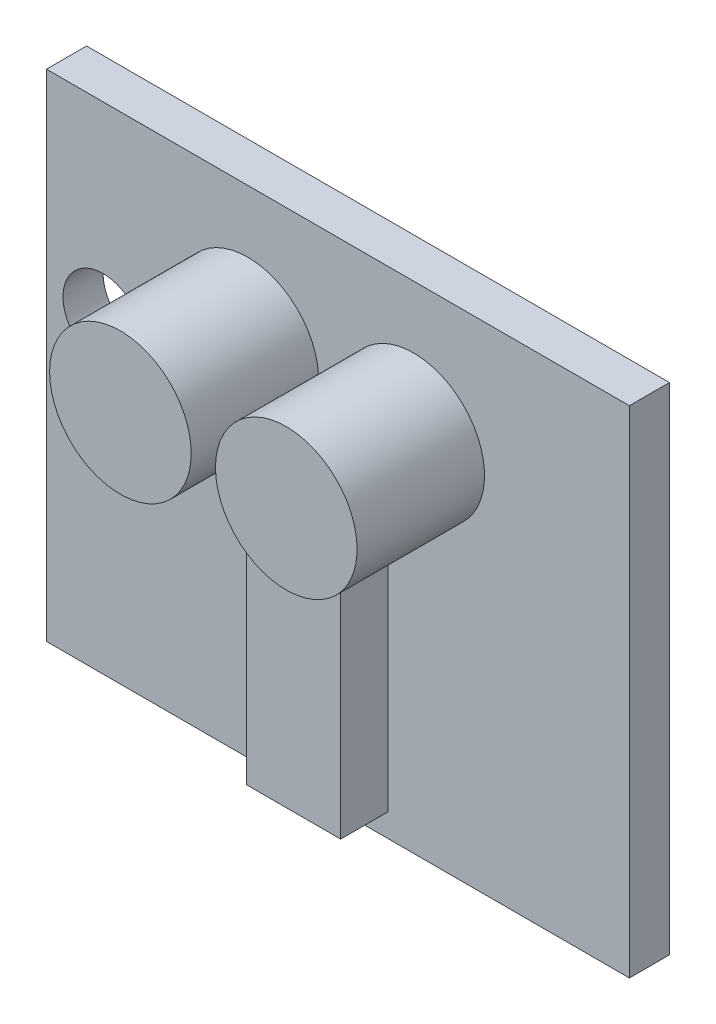
ISO-10303-21;
HEADER;
FILE_DESCRIPTION(('STEP AP214'),'2;1');
FILE_NAME('part.step','',(''),(''),'','','');
FILE_SCHEMA(('AUTOMOTIVE_DESIGN { 1 0 10303 214 1 1 1 1 }'));
ENDSEC;
DATA;
#1=APPLICATION_CONTEXT('core data for automotive mechanical design processes');
#2=APPLICATION_PROTOCOL_DEFINITION('international standard','automotive_design',2000,#1);
#3=PRODUCT_CONTEXT('',#1,'mechanical');
#4=PRODUCT('Part','Part','',(#3));
#5=PRODUCT_RELATED_PRODUCT_CATEGORY('part','',(#4));
#6=PRODUCT_DEFINITION_FORMATION('','',#4);
#7=PRODUCT_DEFINITION_CONTEXT('part definition',#1,'design');
#8=PRODUCT_DEFINITION('design','',#6,#7);
#9=PRODUCT_DEFINITION_SHAPE('','',#8);
#10=(LENGTH_UNIT() NAMED_UNIT(*) SI_UNIT(.MILLI.,.METRE.));
#11=(NAMED_UNIT(*) PLANE_ANGLE_UNIT() SI_UNIT($,.RADIAN.));
#12=(NAMED_UNIT(*) SI_UNIT($,.STERADIAN.) SOLID_ANGLE_UNIT());
#13=UNCERTAINTY_MEASURE_WITH_UNIT(LENGTH_MEASURE(1.E-05),#10,'distance_accuracy_value','');
#14=(GEOMETRIC_REPRESENTATION_CONTEXT(3) GLOBAL_UNCERTAINTY_ASSIGNED_CONTEXT((#13)) GLOBAL_UNIT_ASSIGNED_CONTEXT((#10,
#11,#12)) REPRESENTATION_CONTEXT('',''));
#15=CARTESIAN_POINT('',(0.,0.,0.));
#16=DIRECTION('',(0.,0.,1.));
#17=DIRECTION('',(1.,0.,0.));
#18=AXIS2_PLACEMENT_3D('',#15,#16,#17);
#19=CARTESIAN_POINT('',(0.,0.,1.7));
#20=DIRECTION('',(0.,0.,1.));
#21=DIRECTION('',(1.,0.,0.));
#22=AXIS2_PLACEMENT_3D('',#19,#20,#21);
#23=PLANE('',#22);
#24=CARTESIAN_POINT('',(-20.7967140729682,124.860667320047,1.7));
#25=DIRECTION('',(0.,0.,1.));
#26=DIRECTION('',(1.,0.,0.));
#27=AXIS2_PLACEMENT_3D('',#24,#25,#26);
#28=CIRCLE('',#27,3.);
#29=CARTESIAN_POINT('',(-23.7967140729682,124.860667320047,1.7));
#30=VERTEX_POINT('',#29);
#31=EDGE_CURVE('E133',#30,#30,#28,.T.);
#32=ORIENTED_EDGE('',*,*,#31,.F.);
#33=EDGE_LOOP('',(#32));
#34=FACE_BOUND('',#33,.T.);
#35=CARTESIAN_POINT('',(-27.8250173424759,124.860667320047,1.7));
#36=DIRECTION('',(0.,0.,1.));
#37=DIRECTION('',(1.,0.,0.));
#38=AXIS2_PLACEMENT_3D('',#35,#36,#37);
#39=CIRCLE('',#38,2.99999999999999);
#40=CARTESIAN_POINT('',(-30.8250173424759,124.860667320047,1.7));
#41=VERTEX_POINT('',#40);
#42=EDGE_CURVE('E142',#41,#41,#39,.T.);
#43=ORIENTED_EDGE('',*,*,#42,.F.);
#44=EDGE_LOOP('',(#43));
#45=FACE_BOUND('',#44,.T.);
#46=DIRECTION('',(0.,-1.,0.));
#47=VECTOR('',#46,1.);
#48=CARTESIAN_POINT('',(-36.3575587339824,130.494849307638,1.7));
#49=LINE('',#48,#47);
#50=CARTESIAN_POINT('',(-36.3575587339824,130.494849307638,1.7));
#51=VERTEX_POINT('',#50);
#52=CARTESIAN_POINT('',(-36.3575587339824,109.494849307638,1.7));
#53=VERTEX_POINT('',#52);
#54=EDGE_CURVE('E156',#51,#53,#49,.T.);
#55=ORIENTED_EDGE('',*,*,#54,.T.);
#56=DIRECTION('',(1.,0.,0.));
#57=VECTOR('',#56,1.);
#58=CARTESIAN_POINT('',(-36.3575587339824,109.494849307638,1.7));
#59=LINE('',#58,#57);
#60=CARTESIAN_POINT('',(-11.6575587339824,109.494849307638,1.7));
#61=VERTEX_POINT('',#60);
#62=EDGE_CURVE('E86',#53,#61,#59,.T.);
#63=ORIENTED_EDGE('',*,*,#62,.T.);
#64=DIRECTION('',(0.,1.,0.));
#65=VECTOR('',#64,1.);
#66=CARTESIAN_POINT('',(-11.6575587339824,130.494849307638,1.7));
#67=LINE('',#66,#65);
#68=CARTESIAN_POINT('',(-11.6575587339824,130.494849307638,1.7));
#69=VERTEX_POINT('',#68);
#70=EDGE_CURVE('E159',#61,#69,#67,.T.);
#71=ORIENTED_EDGE('',*,*,#70,.T.);
#72=DIRECTION('',(-1.,0.,0.));
#73=VECTOR('',#72,1.);
#74=CARTESIAN_POINT('',(-36.3575587339824,130.494849307638,1.7));
#75=LINE('',#74,#73);
#76=EDGE_CURVE('E58',#69,#51,#75,.T.);
#77=ORIENTED_EDGE('',*,*,#76,.T.);
#78=EDGE_LOOP('',(#55,#63,#71,#77));
#79=FACE_BOUND('',#78,.T.);
#80=CARTESIAN_POINT('',(-33.9575587339824,122.494849307638,1.7));
#81=DIRECTION('',(0.,0.,1.));
#82=DIRECTION('',(1.,0.,0.));
#83=AXIS2_PLACEMENT_3D('',#80,#81,#82);
#84=CIRCLE('',#83,1.7);
#85=CARTESIAN_POINT('',(-32.2575587339824,122.494849307638,1.7));
#86=VERTEX_POINT('',#85);
#87=EDGE_CURVE('E150',#86,#86,#84,.T.);
#88=ORIENTED_EDGE('',*,*,#87,.F.);
#89=EDGE_LOOP('',(#88));
#90=FACE_BOUND('',#89,.T.);
#91=DIRECTION('',(-1.,0.,0.));
#92=VECTOR('',#91,1.);
#93=CARTESIAN_POINT('',(-25.8920413251265,120.47395963999,1.7));
#94=LINE('',#93,#92);
#95=CARTESIAN_POINT('',(-21.8920413251265,120.47395963999,1.7));
#96=VERTEX_POINT('',#95);
#97=CARTESIAN_POINT('',(-25.8920413251265,120.47395963999,1.7));
#98=VERTEX_POINT('',#97);
#99=EDGE_CURVE('E336',#96,#98,#94,.T.);
#100=ORIENTED_EDGE('',*,*,#99,.F.);
#101=DIRECTION('',(0.,1.,0.));
#102=VECTOR('',#101,1.);
#103=CARTESIAN_POINT('',(-21.8920413251265,110.47395963999,1.7));
#104=LINE('',#103,#102);
#105=CARTESIAN_POINT('',(-21.8920413251265,110.47395963999,1.7));
#106=VERTEX_POINT('',#105);
#107=EDGE_CURVE('E131',#106,#96,#104,.T.);
#108=ORIENTED_EDGE('',*,*,#107,.F.);
#109=DIRECTION('',(1.,0.,0.));
#110=VECTOR('',#109,1.);
#111=CARTESIAN_POINT('',(-25.8920413251265,110.47395963999,1.7));
#112=LINE('',#111,#110);
#113=CARTESIAN_POINT('',(-25.8920413251265,110.47395963999,1.7));
#114=VERTEX_POINT('',#113);
#115=EDGE_CURVE('E127',#114,#106,#112,.T.);
#116=ORIENTED_EDGE('',*,*,#115,.F.);
#117=DIRECTION('',(0.,-1.,0.));
#118=VECTOR('',#117,1.);
#119=CARTESIAN_POINT('',(-25.8920413251265,110.47395963999,1.7));
#120=LINE('',#119,#118);
#121=EDGE_CURVE('E333',#98,#114,#120,.T.);
#122=ORIENTED_EDGE('',*,*,#121,.F.);
#123=EDGE_LOOP('',(#100,#108,#116,#122));
#124=FACE_BOUND('',#123,.T.);
#125=ADVANCED_FACE('F34',(#34,#45,#79,#90,#124),#23,.T.);
#126=CARTESIAN_POINT('',(0.,0.,0.));
#127=DIRECTION('',(0.,0.,1.));
#128=DIRECTION('',(1.,0.,0.));
#129=AXIS2_PLACEMENT_3D('',#126,#127,#128);
#130=PLANE('',#129);
#131=DIRECTION('',(0.,-1.,0.));
#132=VECTOR('',#131,1.);
#133=CARTESIAN_POINT('',(-36.3575587339824,130.494849307638,0.));
#134=LINE('',#133,#132);
#135=CARTESIAN_POINT('',(-36.3575587339824,130.494849307638,0.));
#136=VERTEX_POINT('',#135);
#137=CARTESIAN_POINT('',(-36.3575587339824,109.494849307638,0.));
#138=VERTEX_POINT('',#137);
#139=EDGE_CURVE('E153',#136,#138,#134,.T.);
#140=ORIENTED_EDGE('',*,*,#139,.F.);
#141=DIRECTION('',(-1.,0.,0.));
#142=VECTOR('',#141,1.);
#143=CARTESIAN_POINT('',(-36.3575587339824,130.494849307638,0.));
#144=LINE('',#143,#142);
#145=CARTESIAN_POINT('',(-11.6575587339824,130.494849307638,0.));
#146=VERTEX_POINT('',#145);
#147=EDGE_CURVE('E79',#146,#136,#144,.T.);
#148=ORIENTED_EDGE('',*,*,#147,.F.);
#149=DIRECTION('',(0.,1.,0.));
#150=VECTOR('',#149,1.);
#151=CARTESIAN_POINT('',(-11.6575587339824,130.494849307638,0.));
#152=LINE('',#151,#150);
#153=CARTESIAN_POINT('',(-11.6575587339824,109.494849307638,0.));
#154=VERTEX_POINT('',#153);
#155=EDGE_CURVE('E167',#154,#146,#152,.T.);
#156=ORIENTED_EDGE('',*,*,#155,.F.);
#157=DIRECTION('',(1.,0.,0.));
#158=VECTOR('',#157,1.);
#159=CARTESIAN_POINT('',(-36.3575587339824,109.494849307638,0.));
#160=LINE('',#159,#158);
#161=EDGE_CURVE('E165',#138,#154,#160,.T.);
#162=ORIENTED_EDGE('',*,*,#161,.F.);
#163=EDGE_LOOP('',(#140,#148,#156,#162));
#164=FACE_BOUND('',#163,.T.);
#165=CARTESIAN_POINT('',(-33.9575587339824,122.494849307638,0.));
#166=DIRECTION('',(0.,0.,1.));
#167=DIRECTION('',(1.,0.,0.));
#168=AXIS2_PLACEMENT_3D('',#165,#166,#167);
#169=CIRCLE('',#168,1.7);
#170=CARTESIAN_POINT('',(-32.2575587339824,122.494849307638,0.));
#171=VERTEX_POINT('',#170);
#172=EDGE_CURVE('E147',#171,#171,#169,.T.);
#173=ORIENTED_EDGE('',*,*,#172,.T.);
#174=EDGE_LOOP('',(#173));
#175=FACE_BOUND('',#174,.T.);
#176=ADVANCED_FACE('F180',(#164,#175),#130,.F.);
#177=CARTESIAN_POINT('',(-36.3575587339824,130.494849307638,1.7));
#178=DIRECTION('',(1.,0.,0.));
#179=DIRECTION('',(0.,0.,-1.));
#180=AXIS2_PLACEMENT_3D('',#177,#178,#179);
#181=PLANE('',#180);
#182=ORIENTED_EDGE('',*,*,#139,.T.);
#183=DIRECTION('',(0.,0.,-1.));
#184=VECTOR('',#183,1.);
#185=CARTESIAN_POINT('',(-36.3575587339824,109.494849307638,1.7));
#186=LINE('',#185,#184);
#187=EDGE_CURVE('E11',#53,#138,#186,.T.);
#188=ORIENTED_EDGE('',*,*,#187,.F.);
#189=ORIENTED_EDGE('',*,*,#54,.F.);
#190=DIRECTION('',(0.,0.,-1.));
#191=VECTOR('',#190,1.);
#192=CARTESIAN_POINT('',(-36.3575587339824,130.494849307638,1.7));
#193=LINE('',#192,#191);
#194=EDGE_CURVE('E162',#51,#136,#193,.T.);
#195=ORIENTED_EDGE('',*,*,#194,.T.);
#196=EDGE_LOOP('',(#182,#188,#189,#195));
#197=FACE_BOUND('',#196,.T.);
#198=ADVANCED_FACE('F36',(#197),#181,.F.);
#199=CARTESIAN_POINT('',(-36.3575587339824,109.494849307638,1.7));
#200=DIRECTION('',(0.,1.,0.));
#201=DIRECTION('',(0.,0.,1.));
#202=AXIS2_PLACEMENT_3D('',#199,#200,#201);
#203=PLANE('',#202);
#204=ORIENTED_EDGE('',*,*,#161,.T.);
#205=DIRECTION('',(0.,0.,-1.));
#206=VECTOR('',#205,1.);
#207=CARTESIAN_POINT('',(-11.6575587339824,109.494849307638,1.7));
#208=LINE('',#207,#206);
#209=EDGE_CURVE('E42',#61,#154,#208,.T.);
#210=ORIENTED_EDGE('',*,*,#209,.F.);
#211=ORIENTED_EDGE('',*,*,#62,.F.);
#212=ORIENTED_EDGE('',*,*,#187,.T.);
#213=EDGE_LOOP('',(#204,#210,#211,#212));
#214=FACE_BOUND('',#213,.T.);
#215=ADVANCED_FACE('F196',(#214),#203,.F.);
#216=CARTESIAN_POINT('',(-11.6575587339824,130.494849307638,1.7));
#217=DIRECTION('',(-1.,0.,0.));
#218=DIRECTION('',(0.,-1.,0.));
#219=AXIS2_PLACEMENT_3D('',#216,#217,#218);
#220=PLANE('',#219);
#221=ORIENTED_EDGE('',*,*,#155,.T.);
#222=DIRECTION('',(0.,0.,-1.));
#223=VECTOR('',#222,1.);
#224=CARTESIAN_POINT('',(-11.6575587339824,130.494849307638,1.7));
#225=LINE('',#224,#223);
#226=EDGE_CURVE('E171',#69,#146,#225,.T.);
#227=ORIENTED_EDGE('',*,*,#226,.F.);
#228=ORIENTED_EDGE('',*,*,#70,.F.);
#229=ORIENTED_EDGE('',*,*,#209,.T.);
#230=EDGE_LOOP('',(#221,#227,#228,#229));
#231=FACE_BOUND('',#230,.T.);
#232=ADVANCED_FACE('F176',(#231),#220,.F.);
#233=CARTESIAN_POINT('',(-36.3575587339824,130.494849307638,1.7));
#234=DIRECTION('',(0.,-1.,0.));
#235=DIRECTION('',(0.,0.,-1.));
#236=AXIS2_PLACEMENT_3D('',#233,#234,#235);
#237=PLANE('',#236);
#238=ORIENTED_EDGE('',*,*,#147,.T.);
#239=ORIENTED_EDGE('',*,*,#194,.F.);
#240=ORIENTED_EDGE('',*,*,#76,.F.);
#241=ORIENTED_EDGE('',*,*,#226,.T.);
#242=EDGE_LOOP('',(#238,#239,#240,#241));
#243=FACE_BOUND('',#242,.T.);
#244=ADVANCED_FACE('F185',(#243),#237,.F.);
#245=CARTESIAN_POINT('',(-33.9575587339824,122.494849307638,1.7));
#246=DIRECTION('',(0.,0.,-1.));
#247=DIRECTION('',(-1.,0.,0.));
#248=AXIS2_PLACEMENT_3D('',#245,#246,#247);
#249=CYLINDRICAL_SURFACE('',#248,1.7);
#250=ORIENTED_EDGE('',*,*,#87,.T.);
#251=EDGE_LOOP('',(#250));
#252=FACE_BOUND('',#251,.T.);
#253=ORIENTED_EDGE('',*,*,#172,.F.);
#254=EDGE_LOOP('',(#253));
#255=FACE_BOUND('',#254,.T.);
#256=ADVANCED_FACE('F187',(#252,#255),#249,.F.);
#257=CARTESIAN_POINT('',(-27.8250173424759,124.860667320047,7.1));
#258=DIRECTION('',(0.,0.,-1.));
#259=DIRECTION('',(-1.,0.,0.));
#260=AXIS2_PLACEMENT_3D('',#257,#258,#259);
#261=CYLINDRICAL_SURFACE('',#260,2.99999999999999);
#262=CARTESIAN_POINT('',(-27.8250173424759,124.860667320047,7.1));
#263=DIRECTION('',(0.,0.,1.));
#264=DIRECTION('',(1.,0.,0.));
#265=AXIS2_PLACEMENT_3D('',#262,#263,#264);
#266=CIRCLE('',#265,2.99999999999999);
#267=CARTESIAN_POINT('',(-30.8250173424759,124.860667320047,7.1));
#268=VERTEX_POINT('',#267);
#269=EDGE_CURVE('E144',#268,#268,#266,.T.);
#270=CARTESIAN_POINT('',(-30.8250173424759,124.860667320047,7.1));
#271=CARTESIAN_POINT('',(-30.8250173424759,124.860667320047,7.04375));
#272=CARTESIAN_POINT('',(-30.8250173424759,124.860667320047,6.9875));
#273=CARTESIAN_POINT('',(-30.8250173424759,124.860667320047,6.875));
#274=CARTESIAN_POINT('',(-30.8250173424759,124.860667320047,6.81875));
#275=CARTESIAN_POINT('',(-30.8250173424759,124.860667320047,6.70625));
#276=CARTESIAN_POINT('',(-30.8250173424759,124.860667320047,6.65));
#277=CARTESIAN_POINT('',(-30.8250173424759,124.860667320047,6.5375));
#278=CARTESIAN_POINT('',(-30.8250173424759,124.860667320047,6.48125));
#279=CARTESIAN_POINT('',(-30.8250173424759,124.860667320047,6.36875));
#280=CARTESIAN_POINT('',(-30.8250173424759,124.860667320047,6.3125));
#281=CARTESIAN_POINT('',(-30.8250173424759,124.860667320047,6.2));
#282=CARTESIAN_POINT('',(-30.8250173424759,124.860667320047,6.14375));
#283=CARTESIAN_POINT('',(-30.8250173424759,124.860667320047,6.03125));
#284=CARTESIAN_POINT('',(-30.8250173424759,124.860667320047,5.975));
#285=CARTESIAN_POINT('',(-30.8250173424759,124.860667320047,5.8625));
#286=CARTESIAN_POINT('',(-30.8250173424759,124.860667320047,5.80625));
#287=CARTESIAN_POINT('',(-30.8250173424759,124.860667320047,5.69375));
#288=CARTESIAN_POINT('',(-30.8250173424759,124.860667320047,5.6375));
#289=CARTESIAN_POINT('',(-30.8250173424759,124.860667320047,5.525));
#290=CARTESIAN_POINT('',(-30.8250173424759,124.860667320047,5.46875));
#291=CARTESIAN_POINT('',(-30.8250173424759,124.860667320047,5.35625));
#292=CARTESIAN_POINT('',(-30.8250173424759,124.860667320047,5.3));
#293=CARTESIAN_POINT('',(-30.8250173424759,124.860667320047,5.1875));
#294=CARTESIAN_POINT('',(-30.8250173424759,124.860667320047,5.13125));
#295=CARTESIAN_POINT('',(-30.8250173424759,124.860667320047,5.01875));
#296=CARTESIAN_POINT('',(-30.8250173424759,124.860667320047,4.9625));
#297=CARTESIAN_POINT('',(-30.8250173424759,124.860667320047,4.85));
#298=CARTESIAN_POINT('',(-30.8250173424759,124.860667320047,4.79375));
#299=CARTESIAN_POINT('',(-30.8250173424759,124.860667320047,4.68125));
#300=CARTESIAN_POINT('',(-30.8250173424759,124.860667320047,4.625));
#301=CARTESIAN_POINT('',(-30.8250173424759,124.860667320047,4.5125));
#302=CARTESIAN_POINT('',(-30.8250173424759,124.860667320047,4.45625));
#303=CARTESIAN_POINT('',(-30.8250173424759,124.860667320047,4.34375));
#304=CARTESIAN_POINT('',(-30.8250173424759,124.860667320047,4.2875));
#305=CARTESIAN_POINT('',(-30.8250173424759,124.860667320047,4.175));
#306=CARTESIAN_POINT('',(-30.8250173424759,124.860667320047,4.11875));
#307=CARTESIAN_POINT('',(-30.8250173424759,124.860667320047,4.00625));
#308=CARTESIAN_POINT('',(-30.8250173424759,124.860667320047,3.95));
#309=CARTESIAN_POINT('',(-30.8250173424759,124.860667320047,3.8375));
#310=CARTESIAN_POINT('',(-30.8250173424759,124.860667320047,3.78125));
#311=CARTESIAN_POINT('',(-30.8250173424759,124.860667320047,3.66875));
#312=CARTESIAN_POINT('',(-30.8250173424759,124.860667320047,3.6125));
#313=CARTESIAN_POINT('',(-30.8250173424759,124.860667320047,3.5));
#314=CARTESIAN_POINT('',(-30.8250173424759,124.860667320047,3.44375));
#315=CARTESIAN_POINT('',(-30.8250173424759,124.860667320047,3.33125));
#316=CARTESIAN_POINT('',(-30.8250173424759,124.860667320047,3.275));
#317=CARTESIAN_POINT('',(-30.8250173424759,124.860667320047,3.1625));
#318=CARTESIAN_POINT('',(-30.8250173424759,124.860667320047,3.10625));
#319=CARTESIAN_POINT('',(-30.8250173424759,124.860667320047,2.99375));
#320=CARTESIAN_POINT('',(-30.8250173424759,124.860667320047,2.9375));
#321=CARTESIAN_POINT('',(-30.8250173424759,124.860667320047,2.825));
#322=CARTESIAN_POINT('',(-30.8250173424759,124.860667320047,2.76875));
#323=CARTESIAN_POINT('',(-30.8250173424759,124.860667320047,2.65625));
#324=CARTESIAN_POINT('',(-30.8250173424759,124.860667320047,2.6));
#325=CARTESIAN_POINT('',(-30.8250173424759,124.860667320047,2.4875));
#326=CARTESIAN_POINT('',(-30.8250173424759,124.860667320047,2.43125));
#327=CARTESIAN_POINT('',(-30.8250173424759,124.860667320047,2.31875));
#328=CARTESIAN_POINT('',(-30.8250173424759,124.860667320047,2.2625));
#329=CARTESIAN_POINT('',(-30.8250173424759,124.860667320047,2.15));
#330=CARTESIAN_POINT('',(-30.8250173424759,124.860667320047,2.09375));
#331=CARTESIAN_POINT('',(-30.8250173424759,124.860667320047,1.98125));
#332=CARTESIAN_POINT('',(-30.8250173424759,124.860667320047,1.925));
#333=CARTESIAN_POINT('',(-30.8250173424759,124.860667320047,1.8125));
#334=CARTESIAN_POINT('',(-30.8250173424759,124.860667320047,1.75625));
#335=CARTESIAN_POINT('',(-30.8250173424759,124.860667320047,1.7));
#336=B_SPLINE_CURVE_WITH_KNOTS('',3,(#270,#271,#272,#273,#274,#275,#276,#277,#278,#279,#280,
#281,#282,#283,#284,#285,#286,#287,#288,#289,#290,#291,#292,#293,#294,#295,#296,#297,#298,#299,
#300,#301,#302,#303,#304,#305,#306,#307,#308,#309,#310,#311,#312,#313,#314,#315,#316,#317,#318,
#319,#320,#321,#322,#323,#324,#325,#326,#327,#328,#329,#330,#331,#332,#333,#334,#335),
.UNSPECIFIED.,.F.,.F.,(4,2,2,2,2,2,2,2,2,2,2,2,2,2,2,2,2,2,2,2,2,2,2,2,2,2,2,2,2,2,2,2,4),(0.,
0.168750000000001,0.3375,0.506250000000001,0.675,0.843750000000001,1.0125,1.18125,1.35,1.51875,
1.6875,1.85625,2.025,2.19375,2.3625,2.53125,2.7,2.86875,3.0375,3.20625,3.375,3.54375,3.7125,
3.88125,4.05,4.21875,4.3875,4.55625,4.725,4.89375,5.0625,5.23125,5.4),.UNSPECIFIED.);
#337=EDGE_CURVE('BSEAM193',#268,#41,#336,.T.);
#338=ORIENTED_EDGE('',*,*,#269,.F.);
#339=ORIENTED_EDGE('',*,*,#42,.T.);
#340=ORIENTED_EDGE('',*,*,#337,.T.);
#341=ORIENTED_EDGE('',*,*,#337,.F.);
#342=EDGE_LOOP('',(#338,#340,#339,#341));
#343=FACE_BOUND('',#342,.T.);
#344=ADVANCED_FACE('F193',(#343),#261,.T.);
#345=CARTESIAN_POINT('',(-27.8250173424759,124.860667320047,7.1));
#346=DIRECTION('',(0.,0.,1.));
#347=DIRECTION('',(1.,0.,0.));
#348=AXIS2_PLACEMENT_3D('',#345,#346,#347);
#349=PLANE('',#348);
#350=ORIENTED_EDGE('',*,*,#269,.T.);
#351=EDGE_LOOP('',(#350));
#352=FACE_BOUND('',#351,.T.);
#353=ADVANCED_FACE('F210',(#352),#349,.T.);
#354=CARTESIAN_POINT('',(-20.7967140729682,124.860667320047,7.1));
#355=DIRECTION('',(0.,0.,-1.));
#356=DIRECTION('',(-1.,0.,0.));
#357=AXIS2_PLACEMENT_3D('',#354,#355,#356);
#358=CYLINDRICAL_SURFACE('',#357,3.);
#359=CARTESIAN_POINT('',(-20.7967140729682,124.860667320047,7.1));
#360=DIRECTION('',(0.,0.,1.));
#361=DIRECTION('',(1.,0.,0.));
#362=AXIS2_PLACEMENT_3D('',#359,#360,#361);
#363=CIRCLE('',#362,3.);
#364=CARTESIAN_POINT('',(-23.7967140729682,124.860667320047,7.1));
#365=VERTEX_POINT('',#364);
#366=EDGE_CURVE('E136',#365,#365,#363,.T.);
#367=CARTESIAN_POINT('',(-23.7967140729682,124.860667320047,7.1));
#368=CARTESIAN_POINT('',(-23.7967140729682,124.860667320047,7.04375));
#369=CARTESIAN_POINT('',(-23.7967140729682,124.860667320047,6.9875));
#370=CARTESIAN_POINT('',(-23.7967140729682,124.860667320047,6.875));
#371=CARTESIAN_POINT('',(-23.7967140729682,124.860667320047,6.81875));
#372=CARTESIAN_POINT('',(-23.7967140729682,124.860667320047,6.70625));
#373=CARTESIAN_POINT('',(-23.7967140729682,124.860667320047,6.65));
#374=CARTESIAN_POINT('',(-23.7967140729682,124.860667320047,6.5375));
#375=CARTESIAN_POINT('',(-23.7967140729682,124.860667320047,6.48125));
#376=CARTESIAN_POINT('',(-23.7967140729682,124.860667320047,6.36875));
#377=CARTESIAN_POINT('',(-23.7967140729682,124.860667320047,6.3125));
#378=CARTESIAN_POINT('',(-23.7967140729682,124.860667320047,6.2));
#379=CARTESIAN_POINT('',(-23.7967140729682,124.860667320047,6.14375));
#380=CARTESIAN_POINT('',(-23.7967140729682,124.860667320047,6.03125));
#381=CARTESIAN_POINT('',(-23.7967140729682,124.860667320047,5.975));
#382=CARTESIAN_POINT('',(-23.7967140729682,124.860667320047,5.8625));
#383=CARTESIAN_POINT('',(-23.7967140729682,124.860667320047,5.80625));
#384=CARTESIAN_POINT('',(-23.7967140729682,124.860667320047,5.69375));
#385=CARTESIAN_POINT('',(-23.7967140729682,124.860667320047,5.6375));
#386=CARTESIAN_POINT('',(-23.7967140729682,124.860667320047,5.525));
#387=CARTESIAN_POINT('',(-23.7967140729682,124.860667320047,5.46875));
#388=CARTESIAN_POINT('',(-23.7967140729682,124.860667320047,5.35625));
#389=CARTESIAN_POINT('',(-23.7967140729682,124.860667320047,5.3));
#390=CARTESIAN_POINT('',(-23.7967140729682,124.860667320047,5.1875));
#391=CARTESIAN_POINT('',(-23.7967140729682,124.860667320047,5.13125));
#392=CARTESIAN_POINT('',(-23.7967140729682,124.860667320047,5.01875));
#393=CARTESIAN_POINT('',(-23.7967140729682,124.860667320047,4.9625));
#394=CARTESIAN_POINT('',(-23.7967140729682,124.860667320047,4.85));
#395=CARTESIAN_POINT('',(-23.7967140729682,124.860667320047,4.79375));
#396=CARTESIAN_POINT('',(-23.7967140729682,124.860667320047,4.68125));
#397=CARTESIAN_POINT('',(-23.7967140729682,124.860667320047,4.625));
#398=CARTESIAN_POINT('',(-23.7967140729682,124.860667320047,4.5125));
#399=CARTESIAN_POINT('',(-23.7967140729682,124.860667320047,4.45625));
#400=CARTESIAN_POINT('',(-23.7967140729682,124.860667320047,4.34375));
#401=CARTESIAN_POINT('',(-23.7967140729682,124.860667320047,4.2875));
#402=CARTESIAN_POINT('',(-23.7967140729682,124.860667320047,4.175));
#403=CARTESIAN_POINT('',(-23.7967140729682,124.860667320047,4.11875));
#404=CARTESIAN_POINT('',(-23.7967140729682,124.860667320047,4.00625));
#405=CARTESIAN_POINT('',(-23.7967140729682,124.860667320047,3.95));
#406=CARTESIAN_POINT('',(-23.7967140729682,124.860667320047,3.8375));
#407=CARTESIAN_POINT('',(-23.7967140729682,124.860667320047,3.78125));
#408=CARTESIAN_POINT('',(-23.7967140729682,124.860667320047,3.66875));
#409=CARTESIAN_POINT('',(-23.7967140729682,124.860667320047,3.6125));
#410=CARTESIAN_POINT('',(-23.7967140729682,124.860667320047,3.5));
#411=CARTESIAN_POINT('',(-23.7967140729682,124.860667320047,3.44375));
#412=CARTESIAN_POINT('',(-23.7967140729682,124.860667320047,3.33125));
#413=CARTESIAN_POINT('',(-23.7967140729682,124.860667320047,3.275));
#414=CARTESIAN_POINT('',(-23.7967140729682,124.860667320047,3.1625));
#415=CARTESIAN_POINT('',(-23.7967140729682,124.860667320047,3.10625));
#416=CARTESIAN_POINT('',(-23.7967140729682,124.860667320047,2.99375));
#417=CARTESIAN_POINT('',(-23.7967140729682,124.860667320047,2.9375));
#418=CARTESIAN_POINT('',(-23.7967140729682,124.860667320047,2.825));
#419=CARTESIAN_POINT('',(-23.7967140729682,124.860667320047,2.76875));
#420=CARTESIAN_POINT('',(-23.7967140729682,124.860667320047,2.65625));
#421=CARTESIAN_POINT('',(-23.7967140729682,124.860667320047,2.6));
#422=CARTESIAN_POINT('',(-23.7967140729682,124.860667320047,2.4875));
#423=CARTESIAN_POINT('',(-23.7967140729682,124.860667320047,2.43125));
#424=CARTESIAN_POINT('',(-23.7967140729682,124.860667320047,2.31875));
#425=CARTESIAN_POINT('',(-23.7967140729682,124.860667320047,2.2625));
#426=CARTESIAN_POINT('',(-23.7967140729682,124.860667320047,2.15));
#427=CARTESIAN_POINT('',(-23.7967140729682,124.860667320047,2.09375));
#428=CARTESIAN_POINT('',(-23.7967140729682,124.860667320047,1.98125));
#429=CARTESIAN_POINT('',(-23.7967140729682,124.860667320047,1.925));
#430=CARTESIAN_POINT('',(-23.7967140729682,124.860667320047,1.8125));
#431=CARTESIAN_POINT('',(-23.7967140729682,124.860667320047,1.75625));
#432=CARTESIAN_POINT('',(-23.7967140729682,124.860667320047,1.7));
#433=B_SPLINE_CURVE_WITH_KNOTS('',3,(#367,#368,#369,#370,#371,#372,#373,#374,#375,#376,#377,
#378,#379,#380,#381,#382,#383,#384,#385,#386,#387,#388,#389,#390,#391,#392,#393,#394,#395,#396,
#397,#398,#399,#400,#401,#402,#403,#404,#405,#406,#407,#408,#409,#410,#411,#412,#413,#414,#415,
#416,#417,#418,#419,#420,#421,#422,#423,#424,#425,#426,#427,#428,#429,#430,#431,#432),
.UNSPECIFIED.,.F.,.F.,(4,2,2,2,2,2,2,2,2,2,2,2,2,2,2,2,2,2,2,2,2,2,2,2,2,2,2,2,2,2,2,2,4),(0.,
0.168750000000001,0.3375,0.506250000000001,0.675,0.843750000000001,1.0125,1.18125,1.35,1.51875,
1.6875,1.85625,2.025,2.19375,2.3625,2.53125,2.7,2.86875,3.0375,3.20625,3.375,3.54375,3.7125,
3.88125,4.05,4.21875,4.3875,4.55625,4.725,4.89375,5.0625,5.23125,5.4),.UNSPECIFIED.);
#434=EDGE_CURVE('BSEAM214',#365,#30,#433,.T.);
#435=ORIENTED_EDGE('',*,*,#366,.F.);
#436=ORIENTED_EDGE('',*,*,#31,.T.);
#437=ORIENTED_EDGE('',*,*,#434,.T.);
#438=ORIENTED_EDGE('',*,*,#434,.F.);
#439=EDGE_LOOP('',(#435,#437,#436,#438));
#440=FACE_BOUND('',#439,.T.);
#441=ADVANCED_FACE('F214',(#440),#358,.T.);
#442=CARTESIAN_POINT('',(-20.7967140729682,124.860667320047,7.1));
#443=DIRECTION('',(0.,0.,1.));
#444=DIRECTION('',(1.,0.,0.));
#445=AXIS2_PLACEMENT_3D('',#442,#443,#444);
#446=PLANE('',#445);
#447=ORIENTED_EDGE('',*,*,#366,.T.);
#448=EDGE_LOOP('',(#447));
#449=FACE_BOUND('',#448,.T.);
#450=ADVANCED_FACE('F218',(#449),#446,.T.);
#451=CARTESIAN_POINT('',(-21.8920413251265,110.47395963999,3.7));
#452=DIRECTION('',(-1.,0.,0.));
#453=DIRECTION('',(0.,0.,1.));
#454=AXIS2_PLACEMENT_3D('',#451,#452,#453);
#455=PLANE('',#454);
#456=ORIENTED_EDGE('',*,*,#107,.T.);
#457=DIRECTION('',(0.,0.,-1.));
#458=VECTOR('',#457,1.);
#459=CARTESIAN_POINT('',(-21.8920413251265,120.47395963999,3.7));
#460=LINE('',#459,#458);
#461=CARTESIAN_POINT('',(-21.8920413251265,120.47395963999,3.7));
#462=VERTEX_POINT('',#461);
#463=EDGE_CURVE('E112',#462,#96,#460,.T.);
#464=ORIENTED_EDGE('',*,*,#463,.F.);
#465=DIRECTION('',(0.,1.,0.));
#466=VECTOR('',#465,1.);
#467=CARTESIAN_POINT('',(-21.8920413251265,110.47395963999,3.7));
#468=LINE('',#467,#466);
#469=CARTESIAN_POINT('',(-21.8920413251265,110.47395963999,3.7));
#470=VERTEX_POINT('',#469);
#471=EDGE_CURVE('E119',#470,#462,#468,.T.);
#472=ORIENTED_EDGE('',*,*,#471,.F.);
#473=DIRECTION('',(0.,0.,-1.));
#474=VECTOR('',#473,1.);
#475=CARTESIAN_POINT('',(-21.8920413251265,110.47395963999,3.7));
#476=LINE('',#475,#474);
#477=EDGE_CURVE('E330',#470,#106,#476,.T.);
#478=ORIENTED_EDGE('',*,*,#477,.T.);
#479=EDGE_LOOP('',(#456,#464,#472,#478));
#480=FACE_BOUND('',#479,.T.);
#481=ADVANCED_FACE('F129',(#480),#455,.F.);
#482=CARTESIAN_POINT('',(-25.8920413251265,120.47395963999,3.7));
#483=DIRECTION('',(0.,-1.,0.));
#484=DIRECTION('',(0.,0.,-1.));
#485=AXIS2_PLACEMENT_3D('',#482,#483,#484);
#486=PLANE('',#485);
#487=ORIENTED_EDGE('',*,*,#99,.T.);
#488=DIRECTION('',(0.,0.,-1.));
#489=VECTOR('',#488,1.);
#490=CARTESIAN_POINT('',(-25.8920413251265,120.47395963999,3.7));
#491=LINE('',#490,#489);
#492=CARTESIAN_POINT('',(-25.8920413251265,120.47395963999,3.7));
#493=VERTEX_POINT('',#492);
#494=EDGE_CURVE('E115',#493,#98,#491,.T.);
#495=ORIENTED_EDGE('',*,*,#494,.F.);
#496=DIRECTION('',(-1.,0.,0.));
#497=VECTOR('',#496,1.);
#498=CARTESIAN_POINT('',(-25.8920413251265,120.47395963999,3.7));
#499=LINE('',#498,#497);
#500=EDGE_CURVE('E108',#462,#493,#499,.T.);
#501=ORIENTED_EDGE('',*,*,#500,.F.);
#502=ORIENTED_EDGE('',*,*,#463,.T.);
#503=EDGE_LOOP('',(#487,#495,#501,#502));
#504=FACE_BOUND('',#503,.T.);
#505=ADVANCED_FACE('F110',(#504),#486,.F.);
#506=CARTESIAN_POINT('',(-25.8920413251265,110.47395963999,3.7));
#507=DIRECTION('',(1.,0.,0.));
#508=DIRECTION('',(0.,0.,-1.));
#509=AXIS2_PLACEMENT_3D('',#506,#507,#508);
#510=PLANE('',#509);
#511=ORIENTED_EDGE('',*,*,#121,.T.);
#512=DIRECTION('',(0.,0.,-1.));
#513=VECTOR('',#512,1.);
#514=CARTESIAN_POINT('',(-25.8920413251265,110.47395963999,3.7));
#515=LINE('',#514,#513);
#516=CARTESIAN_POINT('',(-25.8920413251265,110.47395963999,3.7));
#517=VERTEX_POINT('',#516);
#518=EDGE_CURVE('E49',#517,#114,#515,.T.);
#519=ORIENTED_EDGE('',*,*,#518,.F.);
#520=DIRECTION('',(0.,-1.,0.));
#521=VECTOR('',#520,1.);
#522=CARTESIAN_POINT('',(-25.8920413251265,110.47395963999,3.7));
#523=LINE('',#522,#521);
#524=EDGE_CURVE('E118',#493,#517,#523,.T.);
#525=ORIENTED_EDGE('',*,*,#524,.F.);
#526=ORIENTED_EDGE('',*,*,#494,.T.);
#527=EDGE_LOOP('',(#511,#519,#525,#526));
#528=FACE_BOUND('',#527,.T.);
#529=ADVANCED_FACE('F227',(#528),#510,.F.);
#530=CARTESIAN_POINT('',(-25.8920413251265,110.47395963999,3.7));
#531=DIRECTION('',(0.,1.,0.));
#532=DIRECTION('',(0.,0.,1.));
#533=AXIS2_PLACEMENT_3D('',#530,#531,#532);
#534=PLANE('',#533);
#535=ORIENTED_EDGE('',*,*,#115,.T.);
#536=ORIENTED_EDGE('',*,*,#477,.F.);
#537=DIRECTION('',(1.,0.,0.));
#538=VECTOR('',#537,1.);
#539=CARTESIAN_POINT('',(-25.8920413251265,110.47395963999,3.7));
#540=LINE('',#539,#538);
#541=EDGE_CURVE('E123',#517,#470,#540,.T.);
#542=ORIENTED_EDGE('',*,*,#541,.F.);
#543=ORIENTED_EDGE('',*,*,#518,.T.);
#544=EDGE_LOOP('',(#535,#536,#542,#543));
#545=FACE_BOUND('',#544,.T.);
#546=ADVANCED_FACE('F230',(#545),#534,.F.);
#547=CARTESIAN_POINT('',(0.,0.,3.7));
#548=DIRECTION('',(0.,0.,-1.));
#549=DIRECTION('',(-1.,0.,0.));
#550=AXIS2_PLACEMENT_3D('',#547,#548,#549);
#551=PLANE('',#550);
#552=ORIENTED_EDGE('',*,*,#471,.T.);
#553=ORIENTED_EDGE('',*,*,#500,.T.);
#554=ORIENTED_EDGE('',*,*,#524,.T.);
#555=ORIENTED_EDGE('',*,*,#541,.T.);
#556=EDGE_LOOP('',(#552,#553,#554,#555));
#557=FACE_BOUND('',#556,.T.);
#558=ADVANCED_FACE('F122',(#557),#551,.F.);
#559=CLOSED_SHELL('',(#125,#176,#198,#215,#232,#244,#256,#344,#353,#441,#450,#481,#505,#529,
#546,#558));
#560=MANIFOLD_SOLID_BREP('B2',#559);
#561=ADVANCED_BREP_SHAPE_REPRESENTATION('',(#18,#560),#14);
#562=SHAPE_DEFINITION_REPRESENTATION(#9,#561);
ENDSEC;
END-ISO-10303-21;
